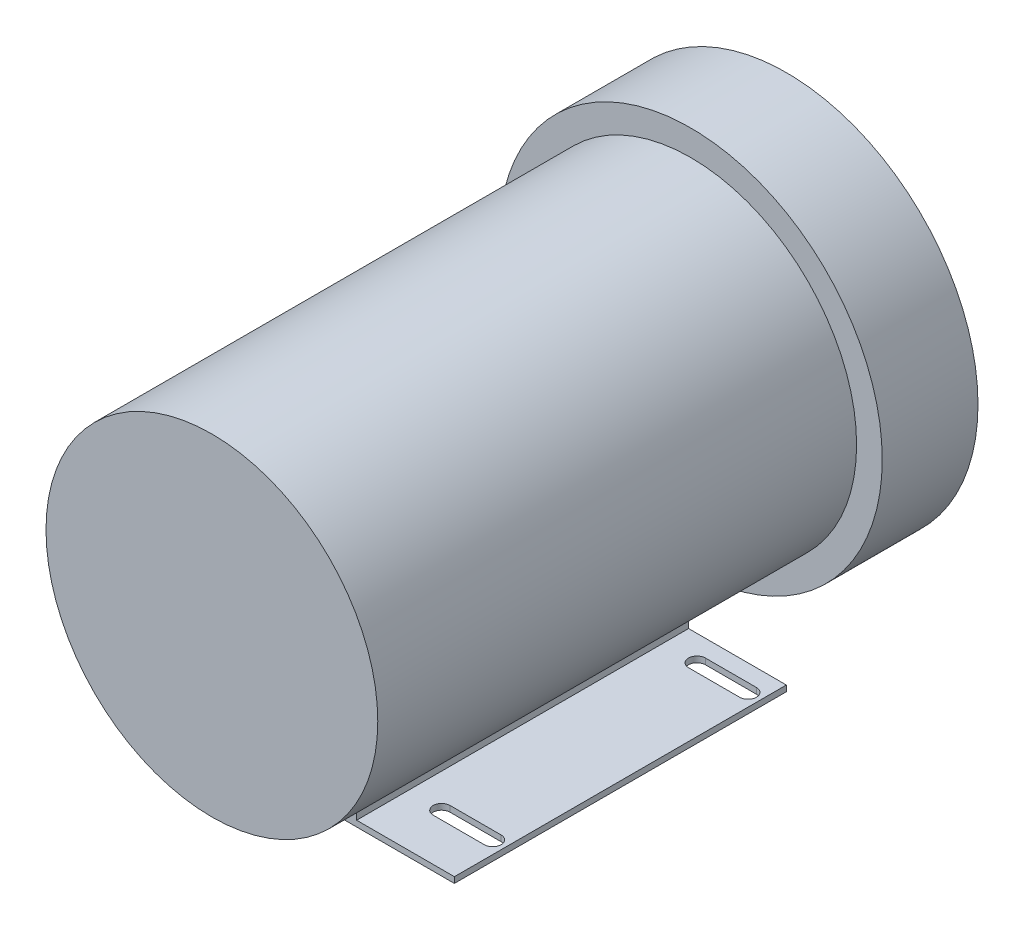
ISO-10303-21;
HEADER;
FILE_DESCRIPTION(('STEP AP214'),'2;1');
FILE_NAME('part.step','',(''),(''),'','','');
FILE_SCHEMA(('AUTOMOTIVE_DESIGN { 1 0 10303 214 1 1 1 1 }'));
ENDSEC;
DATA;
#1=APPLICATION_CONTEXT('core data for automotive mechanical design processes');
#2=APPLICATION_PROTOCOL_DEFINITION('international standard','automotive_design',2000,#1);
#3=PRODUCT_CONTEXT('',#1,'mechanical');
#4=PRODUCT('Part','Part','',(#3));
#5=PRODUCT_RELATED_PRODUCT_CATEGORY('part','',(#4));
#6=PRODUCT_DEFINITION_FORMATION('','',#4);
#7=PRODUCT_DEFINITION_CONTEXT('part definition',#1,'design');
#8=PRODUCT_DEFINITION('design','',#6,#7);
#9=PRODUCT_DEFINITION_SHAPE('','',#8);
#10=(LENGTH_UNIT() NAMED_UNIT(*) SI_UNIT(.MILLI.,.METRE.));
#11=(NAMED_UNIT(*) PLANE_ANGLE_UNIT() SI_UNIT($,.RADIAN.));
#12=(NAMED_UNIT(*) SI_UNIT($,.STERADIAN.) SOLID_ANGLE_UNIT());
#13=UNCERTAINTY_MEASURE_WITH_UNIT(LENGTH_MEASURE(1.E-05),#10,'distance_accuracy_value','');
#14=(GEOMETRIC_REPRESENTATION_CONTEXT(3) GLOBAL_UNCERTAINTY_ASSIGNED_CONTEXT((#13)) GLOBAL_UNIT_ASSIGNED_CONTEXT((#10,
#11,#12)) REPRESENTATION_CONTEXT('',''));
#15=CARTESIAN_POINT('',(0.,0.,0.));
#16=DIRECTION('',(0.,0.,1.));
#17=DIRECTION('',(1.,0.,0.));
#18=AXIS2_PLACEMENT_3D('',#15,#16,#17);
#19=CARTESIAN_POINT('',(0.,-85.979,-203.2));
#20=DIRECTION('',(0.,1.,0.));
#21=DIRECTION('',(-1.,0.,0.));
#22=AXIS2_PLACEMENT_3D('',#19,#20,#21);
#23=PLANE('',#22);
#24=DIRECTION('',(-1.,0.,0.));
#25=VECTOR('',#24,1.);
#26=CARTESIAN_POINT('',(0.,-85.979,-38.1));
#27=LINE('',#26,#25);
#28=CARTESIAN_POINT('',(82.4992,-85.979,-38.1));
#29=VERTEX_POINT('',#28);
#30=CARTESIAN_POINT('',(33.8736104083522,-85.979,-38.1));
#31=VERTEX_POINT('',#30);
#32=EDGE_CURVE('E471',#29,#31,#27,.T.);
#33=ORIENTED_EDGE('',*,*,#32,.F.);
#34=DIRECTION('',(0.,0.,1.));
#35=VECTOR('',#34,1.);
#36=CARTESIAN_POINT('',(82.4992,-85.979,-203.2));
#37=LINE('',#36,#35);
#38=CARTESIAN_POINT('',(82.4992,-85.979,-203.2));
#39=VERTEX_POINT('',#38);
#40=EDGE_CURVE('E493',#39,#29,#37,.T.);
#41=ORIENTED_EDGE('',*,*,#40,.F.);
#42=DIRECTION('',(-1.,0.,0.));
#43=VECTOR('',#42,1.);
#44=CARTESIAN_POINT('',(0.,-85.979,-203.2));
#45=LINE('',#44,#43);
#46=CARTESIAN_POINT('',(33.8736104083522,-85.979,-203.2));
#47=VERTEX_POINT('',#46);
#48=EDGE_CURVE('E446',#39,#47,#45,.T.);
#49=ORIENTED_EDGE('',*,*,#48,.T.);
#50=DIRECTION('',(0.,0.,1.));
#51=VECTOR('',#50,1.);
#52=CARTESIAN_POINT('',(33.8736104083522,-85.979,-203.2));
#53=LINE('',#52,#51);
#54=EDGE_CURVE('E490',#47,#31,#53,.T.);
#55=ORIENTED_EDGE('',*,*,#54,.T.);
#56=EDGE_LOOP('',(#33,#41,#49,#55));
#57=FACE_BOUND('',#56,.T.);
#58=DIRECTION('',(-1.,0.,0.));
#59=VECTOR('',#58,1.);
#60=CARTESIAN_POINT('',(50.7492,-85.979,-186.309));
#61=LINE('',#60,#59);
#62=CARTESIAN_POINT('',(76.1492,-85.979,-186.309));
#63=VERTEX_POINT('',#62);
#64=CARTESIAN_POINT('',(50.7492,-85.979,-186.309));
#65=VERTEX_POINT('',#64);
#66=EDGE_CURVE('E318',#63,#65,#61,.T.);
#67=ORIENTED_EDGE('',*,*,#66,.T.);
#68=CARTESIAN_POINT('',(50.7492,-85.979,-190.5));
#69=DIRECTION('',(0.,-1.,0.));
#70=DIRECTION('',(1.,0.,0.));
#71=AXIS2_PLACEMENT_3D('',#68,#69,#70);
#72=CIRCLE('',#71,4.191);
#73=CARTESIAN_POINT('',(50.7492,-85.979,-194.691));
#74=VERTEX_POINT('',#73);
#75=EDGE_CURVE('E74',#65,#74,#72,.T.);
#76=ORIENTED_EDGE('',*,*,#75,.T.);
#77=DIRECTION('',(1.,0.,0.));
#78=VECTOR('',#77,1.);
#79=CARTESIAN_POINT('',(50.7492,-85.979,-194.691));
#80=LINE('',#79,#78);
#81=CARTESIAN_POINT('',(76.1492,-85.979,-194.691));
#82=VERTEX_POINT('',#81);
#83=EDGE_CURVE('E326',#74,#82,#80,.T.);
#84=ORIENTED_EDGE('',*,*,#83,.T.);
#85=CARTESIAN_POINT('',(76.1492,-85.979,-190.5));
#86=DIRECTION('',(0.,-1.,0.));
#87=DIRECTION('',(1.,0.,0.));
#88=AXIS2_PLACEMENT_3D('',#85,#86,#87);
#89=CIRCLE('',#88,4.191);
#90=EDGE_CURVE('E322',#82,#63,#89,.T.);
#91=ORIENTED_EDGE('',*,*,#90,.T.);
#92=EDGE_LOOP('',(#67,#76,#84,#91));
#93=FACE_BOUND('',#92,.T.);
#94=DIRECTION('',(1.,0.,0.));
#95=VECTOR('',#94,1.);
#96=CARTESIAN_POINT('',(76.1492,-85.979,-67.691));
#97=LINE('',#96,#95);
#98=CARTESIAN_POINT('',(50.7492,-85.979,-67.691));
#99=VERTEX_POINT('',#98);
#100=CARTESIAN_POINT('',(76.1492,-85.979,-67.691));
#101=VERTEX_POINT('',#100);
#102=EDGE_CURVE('E282',#99,#101,#97,.T.);
#103=ORIENTED_EDGE('',*,*,#102,.T.);
#104=CARTESIAN_POINT('',(76.1492,-85.979,-63.5));
#105=DIRECTION('',(0.,-1.,0.));
#106=DIRECTION('',(1.,0.,0.));
#107=AXIS2_PLACEMENT_3D('',#104,#105,#106);
#108=CIRCLE('',#107,4.191);
#109=CARTESIAN_POINT('',(76.1492,-85.979,-59.309));
#110=VERTEX_POINT('',#109);
#111=EDGE_CURVE('E63',#101,#110,#108,.T.);
#112=ORIENTED_EDGE('',*,*,#111,.T.);
#113=DIRECTION('',(-1.,0.,0.));
#114=VECTOR('',#113,1.);
#115=CARTESIAN_POINT('',(76.1492,-85.979,-59.309));
#116=LINE('',#115,#114);
#117=CARTESIAN_POINT('',(50.7492,-85.979,-59.309));
#118=VERTEX_POINT('',#117);
#119=EDGE_CURVE('E273',#110,#118,#116,.T.);
#120=ORIENTED_EDGE('',*,*,#119,.T.);
#121=CARTESIAN_POINT('',(50.7492,-85.979,-63.5));
#122=DIRECTION('',(0.,-1.,0.));
#123=DIRECTION('',(1.,0.,0.));
#124=AXIS2_PLACEMENT_3D('',#121,#122,#123);
#125=CIRCLE('',#124,4.191);
#126=EDGE_CURVE('E291',#118,#99,#125,.T.);
#127=ORIENTED_EDGE('',*,*,#126,.T.);
#128=EDGE_LOOP('',(#103,#112,#120,#127));
#129=FACE_BOUND('',#128,.T.);
#130=ADVANCED_FACE('F44',(#57,#93,#129),#23,.T.);
#131=CARTESIAN_POINT('',(0.,-88.9,-203.2));
#132=DIRECTION('',(0.,1.,0.));
#133=DIRECTION('',(-1.,0.,0.));
#134=AXIS2_PLACEMENT_3D('',#131,#132,#133);
#135=PLANE('',#134);
#136=CARTESIAN_POINT('',(50.7492,-88.9,-190.5));
#137=DIRECTION('',(0.,1.,0.));
#138=DIRECTION('',(-1.,0.,0.));
#139=AXIS2_PLACEMENT_3D('',#136,#137,#138);
#140=CIRCLE('',#139,4.191);
#141=CARTESIAN_POINT('',(50.7492,-88.9,-194.691));
#142=VERTEX_POINT('',#141);
#143=CARTESIAN_POINT('',(50.7492,-88.9,-186.309));
#144=VERTEX_POINT('',#143);
#145=EDGE_CURVE('E312',#142,#144,#140,.T.);
#146=ORIENTED_EDGE('',*,*,#145,.T.);
#147=DIRECTION('',(1.,0.,0.));
#148=VECTOR('',#147,1.);
#149=CARTESIAN_POINT('',(50.7492,-88.9,-186.309));
#150=LINE('',#149,#148);
#151=CARTESIAN_POINT('',(76.1492,-88.9,-186.309));
#152=VERTEX_POINT('',#151);
#153=EDGE_CURVE('E334',#144,#152,#150,.T.);
#154=ORIENTED_EDGE('',*,*,#153,.T.);
#155=CARTESIAN_POINT('',(76.1492,-88.9,-190.5));
#156=DIRECTION('',(0.,1.,0.));
#157=DIRECTION('',(-1.,0.,0.));
#158=AXIS2_PLACEMENT_3D('',#155,#156,#157);
#159=CIRCLE('',#158,4.191);
#160=CARTESIAN_POINT('',(76.1492,-88.9,-194.691));
#161=VERTEX_POINT('',#160);
#162=EDGE_CURVE('E304',#152,#161,#159,.T.);
#163=ORIENTED_EDGE('',*,*,#162,.T.);
#164=DIRECTION('',(-1.,0.,0.));
#165=VECTOR('',#164,1.);
#166=CARTESIAN_POINT('',(50.7492,-88.9,-194.691));
#167=LINE('',#166,#165);
#168=EDGE_CURVE('E308',#161,#142,#167,.T.);
#169=ORIENTED_EDGE('',*,*,#168,.T.);
#170=EDGE_LOOP('',(#146,#154,#163,#169));
#171=FACE_BOUND('',#170,.T.);
#172=DIRECTION('',(1.,0.,0.));
#173=VECTOR('',#172,1.);
#174=CARTESIAN_POINT('',(-76.1492,-88.9,-67.691));
#175=LINE('',#174,#173);
#176=CARTESIAN_POINT('',(-76.1492,-88.9,-67.691));
#177=VERTEX_POINT('',#176);
#178=CARTESIAN_POINT('',(-50.7492,-88.9,-67.691));
#179=VERTEX_POINT('',#178);
#180=EDGE_CURVE('E349',#177,#179,#175,.T.);
#181=ORIENTED_EDGE('',*,*,#180,.F.);
#182=CARTESIAN_POINT('',(-76.1492,-88.9,-63.5));
#183=DIRECTION('',(0.,1.,0.));
#184=DIRECTION('',(-1.,0.,0.));
#185=AXIS2_PLACEMENT_3D('',#182,#183,#184);
#186=CIRCLE('',#185,4.191);
#187=CARTESIAN_POINT('',(-76.1492,-88.9,-59.309));
#188=VERTEX_POINT('',#187);
#189=EDGE_CURVE('E354',#188,#177,#186,.F.);
#190=ORIENTED_EDGE('',*,*,#189,.F.);
#191=DIRECTION('',(-1.,0.,0.));
#192=VECTOR('',#191,1.);
#193=CARTESIAN_POINT('',(-76.1492,-88.9,-59.309));
#194=LINE('',#193,#192);
#195=CARTESIAN_POINT('',(-50.7492,-88.9,-59.309));
#196=VERTEX_POINT('',#195);
#197=EDGE_CURVE('E377',#196,#188,#194,.T.);
#198=ORIENTED_EDGE('',*,*,#197,.F.);
#199=CARTESIAN_POINT('',(-50.7492,-88.9,-63.5));
#200=DIRECTION('',(0.,1.,0.));
#201=DIRECTION('',(-1.,0.,0.));
#202=AXIS2_PLACEMENT_3D('',#199,#200,#201);
#203=CIRCLE('',#202,4.191);
#204=EDGE_CURVE('E346',#179,#196,#203,.F.);
#205=ORIENTED_EDGE('',*,*,#204,.F.);
#206=EDGE_LOOP('',(#181,#190,#198,#205));
#207=FACE_BOUND('',#206,.T.);
#208=DIRECTION('',(-1.,0.,0.));
#209=VECTOR('',#208,1.);
#210=CARTESIAN_POINT('',(-50.7492,-88.9,-186.309));
#211=LINE('',#210,#209);
#212=CARTESIAN_POINT('',(-50.7492,-88.9,-186.309));
#213=VERTEX_POINT('',#212);
#214=CARTESIAN_POINT('',(-76.1492,-88.9,-186.309));
#215=VERTEX_POINT('',#214);
#216=EDGE_CURVE('E393',#213,#215,#211,.T.);
#217=ORIENTED_EDGE('',*,*,#216,.F.);
#218=CARTESIAN_POINT('',(-50.7492,-88.9,-190.5));
#219=DIRECTION('',(0.,1.,0.));
#220=DIRECTION('',(-1.,0.,0.));
#221=AXIS2_PLACEMENT_3D('',#218,#219,#220);
#222=CIRCLE('',#221,4.191);
#223=CARTESIAN_POINT('',(-50.7492,-88.9,-194.691));
#224=VERTEX_POINT('',#223);
#225=EDGE_CURVE('E397',#224,#213,#222,.F.);
#226=ORIENTED_EDGE('',*,*,#225,.F.);
#227=DIRECTION('',(1.,0.,0.));
#228=VECTOR('',#227,1.);
#229=CARTESIAN_POINT('',(-50.7492,-88.9,-194.691));
#230=LINE('',#229,#228);
#231=CARTESIAN_POINT('',(-76.1492,-88.9,-194.691));
#232=VERTEX_POINT('',#231);
#233=EDGE_CURVE('E350',#232,#224,#230,.T.);
#234=ORIENTED_EDGE('',*,*,#233,.F.);
#235=CARTESIAN_POINT('',(-76.1492,-88.9,-190.5));
#236=DIRECTION('',(0.,1.,0.));
#237=DIRECTION('',(-1.,0.,0.));
#238=AXIS2_PLACEMENT_3D('',#235,#236,#237);
#239=CIRCLE('',#238,4.191);
#240=EDGE_CURVE('E266',#215,#232,#239,.F.);
#241=ORIENTED_EDGE('',*,*,#240,.F.);
#242=EDGE_LOOP('',(#217,#226,#234,#241));
#243=FACE_BOUND('',#242,.T.);
#244=DIRECTION('',(-1.,0.,0.));
#245=VECTOR('',#244,1.);
#246=CARTESIAN_POINT('',(0.,-88.9,-38.1));
#247=LINE('',#246,#245);
#248=CARTESIAN_POINT('',(82.4992,-88.9,-38.1));
#249=VERTEX_POINT('',#248);
#250=CARTESIAN_POINT('',(-82.4992,-88.9,-38.1));
#251=VERTEX_POINT('',#250);
#252=EDGE_CURVE('E475',#249,#251,#247,.T.);
#253=ORIENTED_EDGE('',*,*,#252,.T.);
#254=DIRECTION('',(0.,0.,1.));
#255=VECTOR('',#254,1.);
#256=CARTESIAN_POINT('',(-82.4992,-88.9,-203.2));
#257=LINE('',#256,#255);
#258=CARTESIAN_POINT('',(-82.4992,-88.9,-203.2));
#259=VERTEX_POINT('',#258);
#260=EDGE_CURVE('E499',#259,#251,#257,.T.);
#261=ORIENTED_EDGE('',*,*,#260,.F.);
#262=DIRECTION('',(-1.,0.,0.));
#263=VECTOR('',#262,1.);
#264=CARTESIAN_POINT('',(0.,-88.9,-203.2));
#265=LINE('',#264,#263);
#266=CARTESIAN_POINT('',(82.4992,-88.9,-203.2));
#267=VERTEX_POINT('',#266);
#268=EDGE_CURVE('E449',#267,#259,#265,.T.);
#269=ORIENTED_EDGE('',*,*,#268,.F.);
#270=DIRECTION('',(0.,0.,1.));
#271=VECTOR('',#270,1.);
#272=CARTESIAN_POINT('',(82.4992,-88.9,-203.2));
#273=LINE('',#272,#271);
#274=EDGE_CURVE('E496',#267,#249,#273,.T.);
#275=ORIENTED_EDGE('',*,*,#274,.T.);
#276=EDGE_LOOP('',(#253,#261,#269,#275));
#277=FACE_BOUND('',#276,.T.);
#278=CARTESIAN_POINT('',(76.1492,-88.9,-63.5));
#279=DIRECTION('',(0.,1.,0.));
#280=DIRECTION('',(-1.,0.,0.));
#281=AXIS2_PLACEMENT_3D('',#278,#279,#280);
#282=CIRCLE('',#281,4.191);
#283=CARTESIAN_POINT('',(76.1492,-88.9,-59.309));
#284=VERTEX_POINT('',#283);
#285=CARTESIAN_POINT('',(76.1492,-88.9,-67.691));
#286=VERTEX_POINT('',#285);
#287=EDGE_CURVE('E270',#284,#286,#282,.T.);
#288=ORIENTED_EDGE('',*,*,#287,.T.);
#289=DIRECTION('',(-1.,0.,0.));
#290=VECTOR('',#289,1.);
#291=CARTESIAN_POINT('',(76.1492,-88.9,-67.691));
#292=LINE('',#291,#290);
#293=CARTESIAN_POINT('',(50.7492,-88.9,-67.691));
#294=VERTEX_POINT('',#293);
#295=EDGE_CURVE('E255',#286,#294,#292,.T.);
#296=ORIENTED_EDGE('',*,*,#295,.T.);
#297=CARTESIAN_POINT('',(50.7492,-88.9,-63.5));
#298=DIRECTION('',(0.,1.,0.));
#299=DIRECTION('',(-1.,0.,0.));
#300=AXIS2_PLACEMENT_3D('',#297,#298,#299);
#301=CIRCLE('',#300,4.191);
#302=CARTESIAN_POINT('',(50.7492,-88.9,-59.309));
#303=VERTEX_POINT('',#302);
#304=EDGE_CURVE('E285',#294,#303,#301,.T.);
#305=ORIENTED_EDGE('',*,*,#304,.T.);
#306=DIRECTION('',(1.,0.,0.));
#307=VECTOR('',#306,1.);
#308=CARTESIAN_POINT('',(76.1492,-88.9,-59.309));
#309=LINE('',#308,#307);
#310=EDGE_CURVE('E277',#303,#284,#309,.T.);
#311=ORIENTED_EDGE('',*,*,#310,.T.);
#312=EDGE_LOOP('',(#288,#296,#305,#311));
#313=FACE_BOUND('',#312,.T.);
#314=ADVANCED_FACE('F276',(#171,#207,#243,#277,#313),#135,.F.);
#315=CARTESIAN_POINT('',(0.,0.,-285.75));
#316=DIRECTION('',(0.,0.,1.));
#317=DIRECTION('',(1.,0.,0.));
#318=AXIS2_PLACEMENT_3D('',#315,#316,#317);
#319=CYLINDRICAL_SURFACE('',#318,82.4992);
#320=CARTESIAN_POINT('',(0.,0.,0.));
#321=DIRECTION('',(0.,0.,1.));
#322=DIRECTION('',(1.,0.,0.));
#323=AXIS2_PLACEMENT_3D('',#320,#321,#322);
#324=CIRCLE('',#323,82.4992);
#325=CARTESIAN_POINT('',(82.4992,0.,0.));
#326=VERTEX_POINT('',#325);
#327=EDGE_CURVE('E11',#326,#326,#324,.T.);
#328=ORIENTED_EDGE('',*,*,#327,.F.);
#329=EDGE_LOOP('',(#328));
#330=FACE_BOUND('',#329,.T.);
#331=CARTESIAN_POINT('',(0.,0.,-238.125));
#332=DIRECTION('',(0.,0.,-1.));
#333=DIRECTION('',(-1.,0.,0.));
#334=AXIS2_PLACEMENT_3D('',#331,#332,#333);
#335=CIRCLE('',#334,82.4992);
#336=CARTESIAN_POINT('',(-82.4992,0.,-238.125));
#337=VERTEX_POINT('',#336);
#338=EDGE_CURVE('E48',#337,#337,#335,.F.);
#339=ORIENTED_EDGE('',*,*,#338,.T.);
#340=EDGE_LOOP('',(#339));
#341=FACE_BOUND('',#340,.T.);
#342=DIRECTION('',(0.,0.,1.));
#343=VECTOR('',#342,1.);
#344=CARTESIAN_POINT('',(33.8736104083522,-75.2243080296733,-203.2));
#345=LINE('',#344,#343);
#346=CARTESIAN_POINT('',(33.8736104083522,-75.2243080296734,-203.2));
#347=VERTEX_POINT('',#346);
#348=CARTESIAN_POINT('',(33.8736104083522,-75.2243080296733,-38.1));
#349=VERTEX_POINT('',#348);
#350=EDGE_CURVE('E485',#347,#349,#345,.T.);
#351=ORIENTED_EDGE('',*,*,#350,.F.);
#352=CARTESIAN_POINT('',(0.,0.,-203.2));
#353=DIRECTION('',(0.,0.,1.));
#354=DIRECTION('',(1.,0.,0.));
#355=AXIS2_PLACEMENT_3D('',#352,#353,#354);
#356=CIRCLE('',#355,82.4992);
#357=CARTESIAN_POINT('',(-33.8736104083521,-75.2243080296734,-203.2));
#358=VERTEX_POINT('',#357);
#359=EDGE_CURVE('E432',#358,#347,#356,.T.);
#360=ORIENTED_EDGE('',*,*,#359,.F.);
#361=DIRECTION('',(0.,0.,1.));
#362=VECTOR('',#361,1.);
#363=CARTESIAN_POINT('',(-33.8736104083521,-75.2243080296733,-203.2));
#364=LINE('',#363,#362);
#365=CARTESIAN_POINT('',(-33.8736104083521,-75.2243080296733,-38.1));
#366=VERTEX_POINT('',#365);
#367=EDGE_CURVE('E459',#358,#366,#364,.T.);
#368=ORIENTED_EDGE('',*,*,#367,.T.);
#369=CARTESIAN_POINT('',(0.,0.,-38.1));
#370=DIRECTION('',(0.,0.,1.));
#371=DIRECTION('',(1.,0.,0.));
#372=AXIS2_PLACEMENT_3D('',#369,#370,#371);
#373=CIRCLE('',#372,82.4992);
#374=EDGE_CURVE('E390',#366,#349,#373,.T.);
#375=ORIENTED_EDGE('',*,*,#374,.T.);
#376=EDGE_LOOP('',(#351,#360,#368,#375));
#377=FACE_BOUND('',#376,.T.);
#378=ADVANCED_FACE('F46',(#330,#341,#377),#319,.T.);
#379=CARTESIAN_POINT('',(0.,0.,0.));
#380=DIRECTION('',(0.,0.,1.));
#381=DIRECTION('',(1.,0.,0.));
#382=AXIS2_PLACEMENT_3D('',#379,#380,#381);
#383=PLANE('',#382);
#384=ORIENTED_EDGE('',*,*,#327,.T.);
#385=EDGE_LOOP('',(#384));
#386=FACE_BOUND('',#385,.T.);
#387=ADVANCED_FACE('F524',(#386),#383,.T.);
#388=CARTESIAN_POINT('',(0.,0.,-238.125));
#389=DIRECTION('',(0.,0.,-1.));
#390=DIRECTION('',(-1.,0.,0.));
#391=AXIS2_PLACEMENT_3D('',#388,#389,#390);
#392=CYLINDRICAL_SURFACE('',#391,95.25);
#393=CARTESIAN_POINT('',(0.,0.,-238.125));
#394=DIRECTION('',(0.,0.,-1.));
#395=DIRECTION('',(-1.,0.,0.));
#396=AXIS2_PLACEMENT_3D('',#393,#394,#395);
#397=CIRCLE('',#396,95.25);
#398=CARTESIAN_POINT('',(-95.25,0.,-238.125));
#399=VERTEX_POINT('',#398);
#400=EDGE_CURVE('E511',#399,#399,#397,.T.);
#401=ORIENTED_EDGE('',*,*,#400,.T.);
#402=EDGE_LOOP('',(#401));
#403=FACE_BOUND('',#402,.T.);
#404=CARTESIAN_POINT('',(0.,0.,-285.75));
#405=DIRECTION('',(0.,0.,-1.));
#406=DIRECTION('',(-1.,0.,0.));
#407=AXIS2_PLACEMENT_3D('',#404,#405,#406);
#408=CIRCLE('',#407,95.25);
#409=CARTESIAN_POINT('',(-95.25,0.,-285.75));
#410=VERTEX_POINT('',#409);
#411=EDGE_CURVE('E489',#410,#410,#408,.T.);
#412=ORIENTED_EDGE('',*,*,#411,.F.);
#413=EDGE_LOOP('',(#412));
#414=FACE_BOUND('',#413,.T.);
#415=ADVANCED_FACE('F521',(#403,#414),#392,.T.);
#416=CARTESIAN_POINT('',(0.,0.,-238.125));
#417=DIRECTION('',(0.,0.,-1.));
#418=DIRECTION('',(-1.,0.,0.));
#419=AXIS2_PLACEMENT_3D('',#416,#417,#418);
#420=PLANE('',#419);
#421=ORIENTED_EDGE('',*,*,#338,.F.);
#422=EDGE_LOOP('',(#421));
#423=FACE_BOUND('',#422,.T.);
#424=ORIENTED_EDGE('',*,*,#400,.F.);
#425=EDGE_LOOP('',(#424));
#426=FACE_BOUND('',#425,.T.);
#427=ADVANCED_FACE('F523',(#423,#426),#420,.F.);
#428=CARTESIAN_POINT('',(0.,0.,-285.75));
#429=DIRECTION('',(0.,0.,1.));
#430=DIRECTION('',(1.,0.,0.));
#431=AXIS2_PLACEMENT_3D('',#428,#429,#430);
#432=PLANE('',#431);
#433=ORIENTED_EDGE('',*,*,#411,.T.);
#434=EDGE_LOOP('',(#433));
#435=FACE_BOUND('',#434,.T.);
#436=ADVANCED_FACE('F519',(#435),#432,.F.);
#437=CARTESIAN_POINT('',(33.8736104083522,0.,-203.2));
#438=DIRECTION('',(-1.,0.,0.));
#439=DIRECTION('',(0.,0.,1.));
#440=AXIS2_PLACEMENT_3D('',#437,#438,#439);
#441=PLANE('',#440);
#442=DIRECTION('',(0.,-1.,0.));
#443=VECTOR('',#442,1.);
#444=CARTESIAN_POINT('',(33.8736104083522,0.,-38.1));
#445=LINE('',#444,#443);
#446=EDGE_CURVE('E437',#349,#31,#445,.T.);
#447=ORIENTED_EDGE('',*,*,#446,.T.);
#448=ORIENTED_EDGE('',*,*,#54,.F.);
#449=DIRECTION('',(0.,-1.,0.));
#450=VECTOR('',#449,1.);
#451=CARTESIAN_POINT('',(33.8736104083522,0.,-203.2));
#452=LINE('',#451,#450);
#453=EDGE_CURVE('E456',#347,#47,#452,.T.);
#454=ORIENTED_EDGE('',*,*,#453,.F.);
#455=ORIENTED_EDGE('',*,*,#350,.T.);
#456=EDGE_LOOP('',(#447,#448,#454,#455));
#457=FACE_BOUND('',#456,.T.);
#458=ADVANCED_FACE('F601',(#457),#441,.F.);
#459=CARTESIAN_POINT('',(82.4992,0.,-203.2));
#460=DIRECTION('',(1.,0.,0.));
#461=DIRECTION('',(0.,0.,-1.));
#462=AXIS2_PLACEMENT_3D('',#459,#460,#461);
#463=PLANE('',#462);
#464=DIRECTION('',(0.,1.,0.));
#465=VECTOR('',#464,1.);
#466=CARTESIAN_POINT('',(82.4992,0.,-38.1));
#467=LINE('',#466,#465);
#468=EDGE_CURVE('E478',#249,#29,#467,.T.);
#469=ORIENTED_EDGE('',*,*,#468,.F.);
#470=ORIENTED_EDGE('',*,*,#274,.F.);
#471=DIRECTION('',(0.,1.,0.));
#472=VECTOR('',#471,1.);
#473=CARTESIAN_POINT('',(82.4992,0.,-203.2));
#474=LINE('',#473,#472);
#475=EDGE_CURVE('E452',#267,#39,#474,.T.);
#476=ORIENTED_EDGE('',*,*,#475,.T.);
#477=ORIENTED_EDGE('',*,*,#40,.T.);
#478=EDGE_LOOP('',(#469,#470,#476,#477));
#479=FACE_BOUND('',#478,.T.);
#480=ADVANCED_FACE('F559',(#479),#463,.T.);
#481=CARTESIAN_POINT('',(-82.4992,0.,-203.2));
#482=DIRECTION('',(1.,0.,0.));
#483=DIRECTION('',(0.,0.,-1.));
#484=AXIS2_PLACEMENT_3D('',#481,#482,#483);
#485=PLANE('',#484);
#486=DIRECTION('',(0.,1.,0.));
#487=VECTOR('',#486,1.);
#488=CARTESIAN_POINT('',(-82.4992,0.,-38.1));
#489=LINE('',#488,#487);
#490=CARTESIAN_POINT('',(-82.4992,-85.979,-38.1));
#491=VERTEX_POINT('',#490);
#492=EDGE_CURVE('E470',#251,#491,#489,.T.);
#493=ORIENTED_EDGE('',*,*,#492,.T.);
#494=DIRECTION('',(0.,0.,1.));
#495=VECTOR('',#494,1.);
#496=CARTESIAN_POINT('',(-82.4992,-85.979,-203.2));
#497=LINE('',#496,#495);
#498=CARTESIAN_POINT('',(-82.4992,-85.979,-203.2));
#499=VERTEX_POINT('',#498);
#500=EDGE_CURVE('E503',#499,#491,#497,.T.);
#501=ORIENTED_EDGE('',*,*,#500,.F.);
#502=DIRECTION('',(0.,1.,0.));
#503=VECTOR('',#502,1.);
#504=CARTESIAN_POINT('',(-82.4992,0.,-203.2));
#505=LINE('',#504,#503);
#506=EDGE_CURVE('E445',#259,#499,#505,.T.);
#507=ORIENTED_EDGE('',*,*,#506,.F.);
#508=ORIENTED_EDGE('',*,*,#260,.T.);
#509=EDGE_LOOP('',(#493,#501,#507,#508));
#510=FACE_BOUND('',#509,.T.);
#511=ADVANCED_FACE('F550',(#510),#485,.F.);
#512=CARTESIAN_POINT('',(-76.1492,-85.979,-63.5));
#513=DIRECTION('',(0.,1.,0.));
#514=DIRECTION('',(-1.,0.,0.));
#515=AXIS2_PLACEMENT_3D('',#512,#513,#514);
#516=CIRCLE('',#515,4.191);
#517=CARTESIAN_POINT('',(-76.1492,-85.979,-67.691));
#518=VERTEX_POINT('',#517);
#519=CARTESIAN_POINT('',(-76.1492,-85.979,-59.309));
#520=VERTEX_POINT('',#519);
#521=EDGE_CURVE('E358',#518,#520,#516,.T.);
#522=ORIENTED_EDGE('',*,*,#521,.F.);
#523=DIRECTION('',(-1.,0.,0.));
#524=VECTOR('',#523,1.);
#525=CARTESIAN_POINT('',(-76.1492,-85.979,-67.691));
#526=LINE('',#525,#524);
#527=CARTESIAN_POINT('',(-50.7492,-85.979,-67.691));
#528=VERTEX_POINT('',#527);
#529=EDGE_CURVE('E369',#528,#518,#526,.T.);
#530=ORIENTED_EDGE('',*,*,#529,.F.);
#531=CARTESIAN_POINT('',(-50.7492,-85.979,-63.5));
#532=DIRECTION('',(0.,1.,0.));
#533=DIRECTION('',(-1.,0.,0.));
#534=AXIS2_PLACEMENT_3D('',#531,#532,#533);
#535=CIRCLE('',#534,4.191);
#536=CARTESIAN_POINT('',(-50.7492,-85.979,-59.309));
#537=VERTEX_POINT('',#536);
#538=EDGE_CURVE('E365',#537,#528,#535,.T.);
#539=ORIENTED_EDGE('',*,*,#538,.F.);
#540=DIRECTION('',(1.,0.,0.));
#541=VECTOR('',#540,1.);
#542=CARTESIAN_POINT('',(-76.1492,-85.979,-59.309));
#543=LINE('',#542,#541);
#544=EDGE_CURVE('E361',#520,#537,#543,.T.);
#545=ORIENTED_EDGE('',*,*,#544,.F.);
#546=EDGE_LOOP('',(#522,#530,#539,#545));
#547=FACE_BOUND('',#546,.T.);
#548=CARTESIAN_POINT('',(-50.7492,-85.979,-190.5));
#549=DIRECTION('',(0.,1.,0.));
#550=DIRECTION('',(-1.,0.,0.));
#551=AXIS2_PLACEMENT_3D('',#548,#549,#550);
#552=CIRCLE('',#551,4.191);
#553=CARTESIAN_POINT('',(-50.7492,-85.979,-186.309));
#554=VERTEX_POINT('',#553);
#555=CARTESIAN_POINT('',(-50.7492,-85.979,-194.691));
#556=VERTEX_POINT('',#555);
#557=EDGE_CURVE('E401',#554,#556,#552,.T.);
#558=ORIENTED_EDGE('',*,*,#557,.F.);
#559=DIRECTION('',(1.,0.,0.));
#560=VECTOR('',#559,1.);
#561=CARTESIAN_POINT('',(-50.7492,-85.979,-186.309));
#562=LINE('',#561,#560);
#563=CARTESIAN_POINT('',(-76.1492,-85.979,-186.309));
#564=VERTEX_POINT('',#563);
#565=EDGE_CURVE('E412',#564,#554,#562,.T.);
#566=ORIENTED_EDGE('',*,*,#565,.F.);
#567=CARTESIAN_POINT('',(-76.1492,-85.979,-190.5));
#568=DIRECTION('',(0.,1.,0.));
#569=DIRECTION('',(-1.,0.,0.));
#570=AXIS2_PLACEMENT_3D('',#567,#568,#569);
#571=CIRCLE('',#570,4.191);
#572=CARTESIAN_POINT('',(-76.1492,-85.979,-194.691));
#573=VERTEX_POINT('',#572);
#574=EDGE_CURVE('E408',#573,#564,#571,.T.);
#575=ORIENTED_EDGE('',*,*,#574,.F.);
#576=DIRECTION('',(-1.,0.,0.));
#577=VECTOR('',#576,1.);
#578=CARTESIAN_POINT('',(-50.7492,-85.979,-194.691));
#579=LINE('',#578,#577);
#580=EDGE_CURVE('E404',#556,#573,#579,.T.);
#581=ORIENTED_EDGE('',*,*,#580,.F.);
#582=EDGE_LOOP('',(#558,#566,#575,#581));
#583=FACE_BOUND('',#582,.T.);
#584=CARTESIAN_POINT('',(-33.8736104083521,-85.979,-38.1));
#585=VERTEX_POINT('',#584);
#586=EDGE_CURVE('E466',#585,#491,#27,.T.);
#587=ORIENTED_EDGE('',*,*,#586,.F.);
#588=DIRECTION('',(0.,0.,1.));
#589=VECTOR('',#588,1.);
#590=CARTESIAN_POINT('',(-33.8736104083521,-85.979,-203.2));
#591=LINE('',#590,#589);
#592=CARTESIAN_POINT('',(-33.8736104083521,-85.979,-203.2));
#593=VERTEX_POINT('',#592);
#594=EDGE_CURVE('E506',#593,#585,#591,.T.);
#595=ORIENTED_EDGE('',*,*,#594,.F.);
#596=EDGE_CURVE('E441',#593,#499,#45,.T.);
#597=ORIENTED_EDGE('',*,*,#596,.T.);
#598=ORIENTED_EDGE('',*,*,#500,.T.);
#599=EDGE_LOOP('',(#587,#595,#597,#598));
#600=FACE_BOUND('',#599,.T.);
#601=ADVANCED_FACE('F538',(#547,#583,#600),#23,.T.);
#602=CARTESIAN_POINT('',(-33.8736104083521,0.,-203.2));
#603=DIRECTION('',(-1.,0.,0.));
#604=DIRECTION('',(0.,0.,1.));
#605=AXIS2_PLACEMENT_3D('',#602,#603,#604);
#606=PLANE('',#605);
#607=DIRECTION('',(0.,-1.,0.));
#608=VECTOR('',#607,1.);
#609=CARTESIAN_POINT('',(-33.8736104083521,0.,-38.1));
#610=LINE('',#609,#608);
#611=EDGE_CURVE('E462',#366,#585,#610,.T.);
#612=ORIENTED_EDGE('',*,*,#611,.F.);
#613=ORIENTED_EDGE('',*,*,#367,.F.);
#614=DIRECTION('',(0.,-1.,0.));
#615=VECTOR('',#614,1.);
#616=CARTESIAN_POINT('',(-33.8736104083521,0.,-203.2));
#617=LINE('',#616,#615);
#618=EDGE_CURVE('E436',#358,#593,#617,.T.);
#619=ORIENTED_EDGE('',*,*,#618,.T.);
#620=ORIENTED_EDGE('',*,*,#594,.T.);
#621=EDGE_LOOP('',(#612,#613,#619,#620));
#622=FACE_BOUND('',#621,.T.);
#623=ADVANCED_FACE('F549',(#622),#606,.T.);
#624=CARTESIAN_POINT('',(0.,0.,-203.2));
#625=DIRECTION('',(0.,0.,1.));
#626=DIRECTION('',(1.,0.,0.));
#627=AXIS2_PLACEMENT_3D('',#624,#625,#626);
#628=PLANE('',#627);
#629=ORIENTED_EDGE('',*,*,#359,.T.);
#630=ORIENTED_EDGE('',*,*,#453,.T.);
#631=ORIENTED_EDGE('',*,*,#48,.F.);
#632=ORIENTED_EDGE('',*,*,#475,.F.);
#633=ORIENTED_EDGE('',*,*,#268,.T.);
#634=ORIENTED_EDGE('',*,*,#506,.T.);
#635=ORIENTED_EDGE('',*,*,#596,.F.);
#636=ORIENTED_EDGE('',*,*,#618,.F.);
#637=EDGE_LOOP('',(#629,#630,#631,#632,#633,#634,#635,#636));
#638=FACE_BOUND('',#637,.T.);
#639=ADVANCED_FACE('F556',(#638),#628,.F.);
#640=CARTESIAN_POINT('',(0.,0.,-38.1));
#641=DIRECTION('',(0.,0.,1.));
#642=DIRECTION('',(1.,0.,0.));
#643=AXIS2_PLACEMENT_3D('',#640,#641,#642);
#644=PLANE('',#643);
#645=ORIENTED_EDGE('',*,*,#374,.F.);
#646=ORIENTED_EDGE('',*,*,#611,.T.);
#647=ORIENTED_EDGE('',*,*,#586,.T.);
#648=ORIENTED_EDGE('',*,*,#492,.F.);
#649=ORIENTED_EDGE('',*,*,#252,.F.);
#650=ORIENTED_EDGE('',*,*,#468,.T.);
#651=ORIENTED_EDGE('',*,*,#32,.T.);
#652=ORIENTED_EDGE('',*,*,#446,.F.);
#653=EDGE_LOOP('',(#645,#646,#647,#648,#649,#650,#651,#652));
#654=FACE_BOUND('',#653,.T.);
#655=ADVANCED_FACE('F577',(#654),#644,.T.);
#656=CARTESIAN_POINT('',(-50.7492,-95.251,-190.5));
#657=DIRECTION('',(0.,1.,0.));
#658=DIRECTION('',(-1.,0.,0.));
#659=AXIS2_PLACEMENT_3D('',#656,#657,#658);
#660=CYLINDRICAL_SURFACE('',#659,4.191);
#661=ORIENTED_EDGE('',*,*,#225,.T.);
#662=DIRECTION('',(0.,1.,0.));
#663=VECTOR('',#662,1.);
#664=CARTESIAN_POINT('',(-50.7492,-95.251,-186.309));
#665=LINE('',#664,#663);
#666=EDGE_CURVE('E417',#213,#554,#665,.T.);
#667=ORIENTED_EDGE('',*,*,#666,.T.);
#668=ORIENTED_EDGE('',*,*,#557,.T.);
#669=DIRECTION('',(0.,1.,0.));
#670=VECTOR('',#669,1.);
#671=CARTESIAN_POINT('',(-50.7492,-95.251,-194.691));
#672=LINE('',#671,#670);
#673=EDGE_CURVE('E416',#224,#556,#672,.T.);
#674=ORIENTED_EDGE('',*,*,#673,.F.);
#675=EDGE_LOOP('',(#661,#667,#668,#674));
#676=FACE_BOUND('',#675,.T.);
#677=ADVANCED_FACE('F656',(#676),#660,.F.);
#678=CARTESIAN_POINT('',(-50.7492,-95.251,-186.309));
#679=DIRECTION('',(0.,0.,1.));
#680=DIRECTION('',(1.,0.,0.));
#681=AXIS2_PLACEMENT_3D('',#678,#679,#680);
#682=PLANE('',#681);
#683=ORIENTED_EDGE('',*,*,#216,.T.);
#684=DIRECTION('',(0.,1.,0.));
#685=VECTOR('',#684,1.);
#686=CARTESIAN_POINT('',(-76.1492,-95.251,-186.309));
#687=LINE('',#686,#685);
#688=EDGE_CURVE('E420',#215,#564,#687,.T.);
#689=ORIENTED_EDGE('',*,*,#688,.T.);
#690=ORIENTED_EDGE('',*,*,#565,.T.);
#691=ORIENTED_EDGE('',*,*,#666,.F.);
#692=EDGE_LOOP('',(#683,#689,#690,#691));
#693=FACE_BOUND('',#692,.T.);
#694=ADVANCED_FACE('F779',(#693),#682,.F.);
#695=CARTESIAN_POINT('',(-76.1492,-95.251,-190.5));
#696=DIRECTION('',(0.,1.,0.));
#697=DIRECTION('',(-1.,0.,0.));
#698=AXIS2_PLACEMENT_3D('',#695,#696,#697);
#699=CYLINDRICAL_SURFACE('',#698,4.191);
#700=ORIENTED_EDGE('',*,*,#240,.T.);
#701=DIRECTION('',(0.,1.,0.));
#702=VECTOR('',#701,1.);
#703=CARTESIAN_POINT('',(-76.1492,-95.251,-194.691));
#704=LINE('',#703,#702);
#705=EDGE_CURVE('E423',#232,#573,#704,.T.);
#706=ORIENTED_EDGE('',*,*,#705,.T.);
#707=ORIENTED_EDGE('',*,*,#574,.T.);
#708=ORIENTED_EDGE('',*,*,#688,.F.);
#709=EDGE_LOOP('',(#700,#706,#707,#708));
#710=FACE_BOUND('',#709,.T.);
#711=ADVANCED_FACE('F782',(#710),#699,.F.);
#712=CARTESIAN_POINT('',(-50.7492,-95.251,-194.691));
#713=DIRECTION('',(0.,0.,-1.));
#714=DIRECTION('',(-1.,0.,0.));
#715=AXIS2_PLACEMENT_3D('',#712,#713,#714);
#716=PLANE('',#715);
#717=ORIENTED_EDGE('',*,*,#233,.T.);
#718=ORIENTED_EDGE('',*,*,#673,.T.);
#719=ORIENTED_EDGE('',*,*,#580,.T.);
#720=ORIENTED_EDGE('',*,*,#705,.F.);
#721=EDGE_LOOP('',(#717,#718,#719,#720));
#722=FACE_BOUND('',#721,.T.);
#723=ADVANCED_FACE('F649',(#722),#716,.F.);
#724=CARTESIAN_POINT('',(-76.1492,-95.251,-63.5));
#725=DIRECTION('',(0.,1.,0.));
#726=DIRECTION('',(-1.,0.,0.));
#727=AXIS2_PLACEMENT_3D('',#724,#725,#726);
#728=CYLINDRICAL_SURFACE('',#727,4.191);
#729=ORIENTED_EDGE('',*,*,#189,.T.);
#730=DIRECTION('',(0.,1.,0.));
#731=VECTOR('',#730,1.);
#732=CARTESIAN_POINT('',(-76.1492,-95.251,-67.691));
#733=LINE('',#732,#731);
#734=EDGE_CURVE('E374',#177,#518,#733,.T.);
#735=ORIENTED_EDGE('',*,*,#734,.T.);
#736=ORIENTED_EDGE('',*,*,#521,.T.);
#737=DIRECTION('',(0.,1.,0.));
#738=VECTOR('',#737,1.);
#739=CARTESIAN_POINT('',(-76.1492,-95.251,-59.309));
#740=LINE('',#739,#738);
#741=EDGE_CURVE('E373',#188,#520,#740,.T.);
#742=ORIENTED_EDGE('',*,*,#741,.F.);
#743=EDGE_LOOP('',(#729,#735,#736,#742));
#744=FACE_BOUND('',#743,.T.);
#745=ADVANCED_FACE('F670',(#744),#728,.F.);
#746=CARTESIAN_POINT('',(-76.1492,-95.251,-67.691));
#747=DIRECTION('',(0.,0.,-1.));
#748=DIRECTION('',(-1.,0.,0.));
#749=AXIS2_PLACEMENT_3D('',#746,#747,#748);
#750=PLANE('',#749);
#751=ORIENTED_EDGE('',*,*,#180,.T.);
#752=DIRECTION('',(0.,1.,0.));
#753=VECTOR('',#752,1.);
#754=CARTESIAN_POINT('',(-50.7492,-95.251,-67.691));
#755=LINE('',#754,#753);
#756=EDGE_CURVE('E378',#179,#528,#755,.T.);
#757=ORIENTED_EDGE('',*,*,#756,.T.);
#758=ORIENTED_EDGE('',*,*,#529,.T.);
#759=ORIENTED_EDGE('',*,*,#734,.F.);
#760=EDGE_LOOP('',(#751,#757,#758,#759));
#761=FACE_BOUND('',#760,.T.);
#762=ADVANCED_FACE('F665',(#761),#750,.F.);
#763=CARTESIAN_POINT('',(-50.7492,-95.251,-63.5));
#764=DIRECTION('',(0.,1.,0.));
#765=DIRECTION('',(-1.,0.,0.));
#766=AXIS2_PLACEMENT_3D('',#763,#764,#765);
#767=CYLINDRICAL_SURFACE('',#766,4.191);
#768=ORIENTED_EDGE('',*,*,#204,.T.);
#769=DIRECTION('',(0.,1.,0.));
#770=VECTOR('',#769,1.);
#771=CARTESIAN_POINT('',(-50.7492,-95.251,-59.309));
#772=LINE('',#771,#770);
#773=EDGE_CURVE('E381',#196,#537,#772,.T.);
#774=ORIENTED_EDGE('',*,*,#773,.T.);
#775=ORIENTED_EDGE('',*,*,#538,.T.);
#776=ORIENTED_EDGE('',*,*,#756,.F.);
#777=EDGE_LOOP('',(#768,#774,#775,#776));
#778=FACE_BOUND('',#777,.T.);
#779=ADVANCED_FACE('F669',(#778),#767,.F.);
#780=CARTESIAN_POINT('',(-76.1492,-95.251,-59.309));
#781=DIRECTION('',(0.,0.,1.));
#782=DIRECTION('',(1.,0.,0.));
#783=AXIS2_PLACEMENT_3D('',#780,#781,#782);
#784=PLANE('',#783);
#785=ORIENTED_EDGE('',*,*,#197,.T.);
#786=ORIENTED_EDGE('',*,*,#741,.T.);
#787=ORIENTED_EDGE('',*,*,#544,.T.);
#788=ORIENTED_EDGE('',*,*,#773,.F.);
#789=EDGE_LOOP('',(#785,#786,#787,#788));
#790=FACE_BOUND('',#789,.T.);
#791=ADVANCED_FACE('F680',(#790),#784,.F.);
#792=CARTESIAN_POINT('',(50.7492,-95.251,-190.5));
#793=DIRECTION('',(0.,1.,0.));
#794=DIRECTION('',(-1.,0.,0.));
#795=AXIS2_PLACEMENT_3D('',#792,#793,#794);
#796=CYLINDRICAL_SURFACE('',#795,4.191);
#797=DIRECTION('',(0.,1.,0.));
#798=VECTOR('',#797,1.);
#799=CARTESIAN_POINT('',(50.7492,-95.251,-194.691));
#800=LINE('',#799,#798);
#801=EDGE_CURVE('E331',#142,#74,#800,.T.);
#802=ORIENTED_EDGE('',*,*,#801,.T.);
#803=ORIENTED_EDGE('',*,*,#75,.F.);
#804=DIRECTION('',(0.,1.,0.));
#805=VECTOR('',#804,1.);
#806=CARTESIAN_POINT('',(50.7492,-95.251,-186.309));
#807=LINE('',#806,#805);
#808=EDGE_CURVE('E330',#144,#65,#807,.T.);
#809=ORIENTED_EDGE('',*,*,#808,.F.);
#810=ORIENTED_EDGE('',*,*,#145,.F.);
#811=EDGE_LOOP('',(#802,#803,#809,#810));
#812=FACE_BOUND('',#811,.T.);
#813=ADVANCED_FACE('F684',(#812),#796,.F.);
#814=CARTESIAN_POINT('',(50.7492,-95.251,-194.691));
#815=DIRECTION('',(0.,0.,1.));
#816=DIRECTION('',(1.,0.,0.));
#817=AXIS2_PLACEMENT_3D('',#814,#815,#816);
#818=PLANE('',#817);
#819=DIRECTION('',(0.,1.,0.));
#820=VECTOR('',#819,1.);
#821=CARTESIAN_POINT('',(76.1492,-95.251,-194.691));
#822=LINE('',#821,#820);
#823=EDGE_CURVE('E335',#161,#82,#822,.T.);
#824=ORIENTED_EDGE('',*,*,#823,.T.);
#825=ORIENTED_EDGE('',*,*,#83,.F.);
#826=ORIENTED_EDGE('',*,*,#801,.F.);
#827=ORIENTED_EDGE('',*,*,#168,.F.);
#828=EDGE_LOOP('',(#824,#825,#826,#827));
#829=FACE_BOUND('',#828,.T.);
#830=ADVANCED_FACE('F692',(#829),#818,.T.);
#831=CARTESIAN_POINT('',(76.1492,-95.251,-190.5));
#832=DIRECTION('',(0.,1.,0.));
#833=DIRECTION('',(-1.,0.,0.));
#834=AXIS2_PLACEMENT_3D('',#831,#832,#833);
#835=CYLINDRICAL_SURFACE('',#834,4.191);
#836=DIRECTION('',(0.,1.,0.));
#837=VECTOR('',#836,1.);
#838=CARTESIAN_POINT('',(76.1492,-95.251,-186.309));
#839=LINE('',#838,#837);
#840=EDGE_CURVE('E338',#152,#63,#839,.T.);
#841=ORIENTED_EDGE('',*,*,#840,.T.);
#842=ORIENTED_EDGE('',*,*,#90,.F.);
#843=ORIENTED_EDGE('',*,*,#823,.F.);
#844=ORIENTED_EDGE('',*,*,#162,.F.);
#845=EDGE_LOOP('',(#841,#842,#843,#844));
#846=FACE_BOUND('',#845,.T.);
#847=ADVANCED_FACE('F695',(#846),#835,.F.);
#848=CARTESIAN_POINT('',(50.7492,-95.251,-186.309));
#849=DIRECTION('',(0.,0.,-1.));
#850=DIRECTION('',(-1.,0.,0.));
#851=AXIS2_PLACEMENT_3D('',#848,#849,#850);
#852=PLANE('',#851);
#853=ORIENTED_EDGE('',*,*,#808,.T.);
#854=ORIENTED_EDGE('',*,*,#66,.F.);
#855=ORIENTED_EDGE('',*,*,#840,.F.);
#856=ORIENTED_EDGE('',*,*,#153,.F.);
#857=EDGE_LOOP('',(#853,#854,#855,#856));
#858=FACE_BOUND('',#857,.T.);
#859=ADVANCED_FACE('F707',(#858),#852,.T.);
#860=CARTESIAN_POINT('',(76.1492,-95.251,-63.5));
#861=DIRECTION('',(0.,1.,0.));
#862=DIRECTION('',(-1.,0.,0.));
#863=AXIS2_PLACEMENT_3D('',#860,#861,#862);
#864=CYLINDRICAL_SURFACE('',#863,4.191);
#865=DIRECTION('',(0.,1.,0.));
#866=VECTOR('',#865,1.);
#867=CARTESIAN_POINT('',(76.1492,-95.251,-59.309));
#868=LINE('',#867,#866);
#869=EDGE_CURVE('E267',#284,#110,#868,.T.);
#870=ORIENTED_EDGE('',*,*,#869,.T.);
#871=ORIENTED_EDGE('',*,*,#111,.F.);
#872=DIRECTION('',(0.,1.,0.));
#873=VECTOR('',#872,1.);
#874=CARTESIAN_POINT('',(76.1492,-95.251,-67.691));
#875=LINE('',#874,#873);
#876=EDGE_CURVE('E258',#286,#101,#875,.T.);
#877=ORIENTED_EDGE('',*,*,#876,.F.);
#878=ORIENTED_EDGE('',*,*,#287,.F.);
#879=EDGE_LOOP('',(#870,#871,#877,#878));
#880=FACE_BOUND('',#879,.T.);
#881=ADVANCED_FACE('F269',(#880),#864,.F.);
#882=CARTESIAN_POINT('',(76.1492,-95.251,-59.309));
#883=DIRECTION('',(0.,0.,-1.));
#884=DIRECTION('',(-1.,0.,0.));
#885=AXIS2_PLACEMENT_3D('',#882,#883,#884);
#886=PLANE('',#885);
#887=DIRECTION('',(0.,1.,0.));
#888=VECTOR('',#887,1.);
#889=CARTESIAN_POINT('',(50.7492,-95.251,-59.309));
#890=LINE('',#889,#888);
#891=EDGE_CURVE('E299',#303,#118,#890,.T.);
#892=ORIENTED_EDGE('',*,*,#891,.T.);
#893=ORIENTED_EDGE('',*,*,#119,.F.);
#894=ORIENTED_EDGE('',*,*,#869,.F.);
#895=ORIENTED_EDGE('',*,*,#310,.F.);
#896=EDGE_LOOP('',(#892,#893,#894,#895));
#897=FACE_BOUND('',#896,.T.);
#898=ADVANCED_FACE('F720',(#897),#886,.T.);
#899=CARTESIAN_POINT('',(50.7492,-95.251,-63.5));
#900=DIRECTION('',(0.,1.,0.));
#901=DIRECTION('',(-1.,0.,0.));
#902=AXIS2_PLACEMENT_3D('',#899,#900,#901);
#903=CYLINDRICAL_SURFACE('',#902,4.191);
#904=DIRECTION('',(0.,1.,0.));
#905=VECTOR('',#904,1.);
#906=CARTESIAN_POINT('',(50.7492,-95.251,-67.691));
#907=LINE('',#906,#905);
#908=EDGE_CURVE('E260',#294,#99,#907,.T.);
#909=ORIENTED_EDGE('',*,*,#908,.T.);
#910=ORIENTED_EDGE('',*,*,#126,.F.);
#911=ORIENTED_EDGE('',*,*,#891,.F.);
#912=ORIENTED_EDGE('',*,*,#304,.F.);
#913=EDGE_LOOP('',(#909,#910,#911,#912));
#914=FACE_BOUND('',#913,.T.);
#915=ADVANCED_FACE('F727',(#914),#903,.F.);
#916=CARTESIAN_POINT('',(76.1492,-95.251,-67.691));
#917=DIRECTION('',(0.,0.,1.));
#918=DIRECTION('',(1.,0.,0.));
#919=AXIS2_PLACEMENT_3D('',#916,#917,#918);
#920=PLANE('',#919);
#921=ORIENTED_EDGE('',*,*,#876,.T.);
#922=ORIENTED_EDGE('',*,*,#102,.F.);
#923=ORIENTED_EDGE('',*,*,#908,.F.);
#924=ORIENTED_EDGE('',*,*,#295,.F.);
#925=EDGE_LOOP('',(#921,#922,#923,#924));
#926=FACE_BOUND('',#925,.T.);
#927=ADVANCED_FACE('F256',(#926),#920,.T.);
#928=CLOSED_SHELL('',(#130,#314,#378,#387,#415,#427,#436,#458,#480,#511,#601,#623,#639,#655,
#677,#694,#711,#723,#745,#762,#779,#791,#813,#830,#847,#859,#881,#898,#915,#927));
#929=MANIFOLD_SOLID_BREP('B2',#928);
#930=ADVANCED_BREP_SHAPE_REPRESENTATION('',(#18,#929),#14);
#931=SHAPE_DEFINITION_REPRESENTATION(#9,#930);
ENDSEC;
END-ISO-10303-21;
